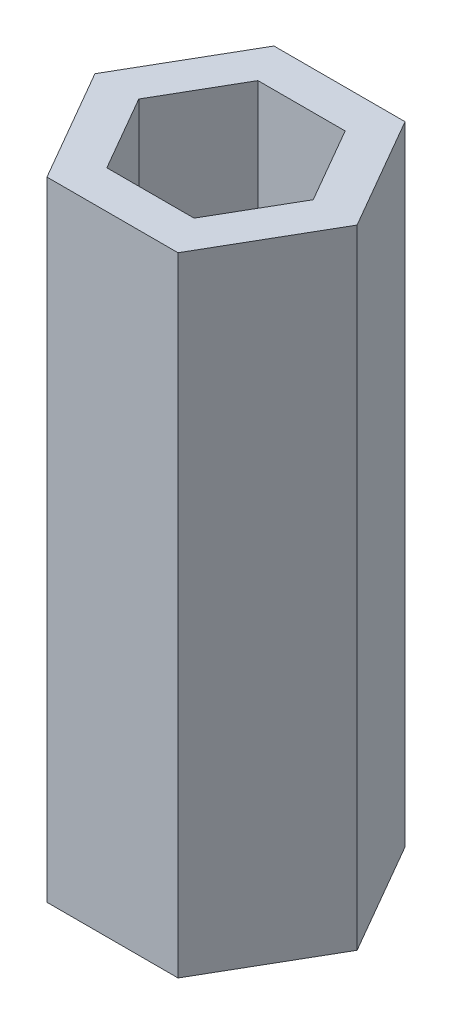
ISO-10303-21;
HEADER;
FILE_DESCRIPTION(('STEP AP214'),'2;1');
FILE_NAME('part.step','',(''),(''),'','','');
FILE_SCHEMA(('AUTOMOTIVE_DESIGN { 1 0 10303 214 1 1 1 1 }'));
ENDSEC;
DATA;
#1=APPLICATION_CONTEXT('core data for automotive mechanical design processes');
#2=APPLICATION_PROTOCOL_DEFINITION('international standard','automotive_design',2000,#1);
#3=PRODUCT_CONTEXT('',#1,'mechanical');
#4=PRODUCT('Part','Part','',(#3));
#5=PRODUCT_RELATED_PRODUCT_CATEGORY('part','',(#4));
#6=PRODUCT_DEFINITION_FORMATION('','',#4);
#7=PRODUCT_DEFINITION_CONTEXT('part definition',#1,'design');
#8=PRODUCT_DEFINITION('design','',#6,#7);
#9=PRODUCT_DEFINITION_SHAPE('','',#8);
#10=(LENGTH_UNIT() NAMED_UNIT(*) SI_UNIT(.MILLI.,.METRE.));
#11=(NAMED_UNIT(*) PLANE_ANGLE_UNIT() SI_UNIT($,.RADIAN.));
#12=(NAMED_UNIT(*) SI_UNIT($,.STERADIAN.) SOLID_ANGLE_UNIT());
#13=UNCERTAINTY_MEASURE_WITH_UNIT(LENGTH_MEASURE(1.E-05),#10,'distance_accuracy_value','');
#14=(GEOMETRIC_REPRESENTATION_CONTEXT(3) GLOBAL_UNCERTAINTY_ASSIGNED_CONTEXT((#13)) GLOBAL_UNIT_ASSIGNED_CONTEXT((#10,
#11,#12)) REPRESENTATION_CONTEXT('',''));
#15=CARTESIAN_POINT('',(0.,0.,0.));
#16=DIRECTION('',(0.,0.,1.));
#17=DIRECTION('',(1.,0.,0.));
#18=AXIS2_PLACEMENT_3D('',#15,#16,#17);
#19=CARTESIAN_POINT('',(0.,29.515472084,0.));
#20=DIRECTION('',(0.,1.,0.));
#21=DIRECTION('',(0.,0.,1.));
#22=AXIS2_PLACEMENT_3D('',#19,#20,#21);
#23=PLANE('',#22);
#24=DIRECTION('',(0.499999999999999,0.,-0.866025403784439));
#25=VECTOR('',#24,1.);
#26=CARTESIAN_POINT('',(3.07958633585747,29.515472084,5.334));
#27=LINE('',#26,#25);
#28=CARTESIAN_POINT('',(3.07958633585747,29.515472084,5.334));
#29=VERTEX_POINT('',#28);
#30=CARTESIAN_POINT('',(6.15917267171493,29.515472084,0.));
#31=VERTEX_POINT('',#30);
#32=EDGE_CURVE('E177',#29,#31,#27,.T.);
#33=ORIENTED_EDGE('',*,*,#32,.T.);
#34=DIRECTION('',(-0.5,0.,-0.866025403784438));
#35=VECTOR('',#34,1.);
#36=CARTESIAN_POINT('',(6.15917267171493,29.515472084,0.));
#37=LINE('',#36,#35);
#38=CARTESIAN_POINT('',(3.07958633585746,29.515472084,-5.334));
#39=VERTEX_POINT('',#38);
#40=EDGE_CURVE('E180',#31,#39,#37,.T.);
#41=ORIENTED_EDGE('',*,*,#40,.T.);
#42=DIRECTION('',(-1.,0.,0.));
#43=VECTOR('',#42,1.);
#44=CARTESIAN_POINT('',(3.07958633585746,29.515472084,-5.334));
#45=LINE('',#44,#43);
#46=CARTESIAN_POINT('',(-3.07958633585747,29.515472084,-5.334));
#47=VERTEX_POINT('',#46);
#48=EDGE_CURVE('E183',#39,#47,#45,.T.);
#49=ORIENTED_EDGE('',*,*,#48,.T.);
#50=DIRECTION('',(-0.5,0.,0.866025403784439));
#51=VECTOR('',#50,1.);
#52=CARTESIAN_POINT('',(-3.07958633585747,29.515472084,-5.334));
#53=LINE('',#52,#51);
#54=CARTESIAN_POINT('',(-6.15917267171493,29.515472084,0.));
#55=VERTEX_POINT('',#54);
#56=EDGE_CURVE('E185',#47,#55,#53,.T.);
#57=ORIENTED_EDGE('',*,*,#56,.T.);
#58=DIRECTION('',(0.5,0.,0.866025403784438));
#59=VECTOR('',#58,1.);
#60=CARTESIAN_POINT('',(-6.15917267171493,29.515472084,0.));
#61=LINE('',#60,#59);
#62=CARTESIAN_POINT('',(-3.07958633585746,29.515472084,5.334));
#63=VERTEX_POINT('',#62);
#64=EDGE_CURVE('E187',#55,#63,#61,.T.);
#65=ORIENTED_EDGE('',*,*,#64,.T.);
#66=DIRECTION('',(1.,0.,0.));
#67=VECTOR('',#66,1.);
#68=CARTESIAN_POINT('',(-3.07958633585746,29.515472084,5.334));
#69=LINE('',#68,#67);
#70=EDGE_CURVE('E189',#63,#29,#69,.T.);
#71=ORIENTED_EDGE('',*,*,#70,.T.);
#72=EDGE_LOOP('',(#33,#41,#49,#57,#65,#71));
#73=FACE_BOUND('',#72,.T.);
#74=DIRECTION('',(-0.500000000000001,0.,-0.866025403784438));
#75=VECTOR('',#74,1.);
#76=CARTESIAN_POINT('',(4.09878276605789,29.515472084,0.));
#77=LINE('',#76,#75);
#78=CARTESIAN_POINT('',(4.09878276605789,29.515472084,0.));
#79=VERTEX_POINT('',#78);
#80=CARTESIAN_POINT('',(2.04939138302894,29.515472084,-3.54964999999999));
#81=VERTEX_POINT('',#80);
#82=EDGE_CURVE('E134',#79,#81,#77,.T.);
#83=ORIENTED_EDGE('',*,*,#82,.F.);
#84=DIRECTION('',(0.499999999999995,0.,-0.866025403784441));
#85=VECTOR('',#84,1.);
#86=CARTESIAN_POINT('',(2.04939138302899,29.515472084,3.54964999999996));
#87=LINE('',#86,#85);
#88=CARTESIAN_POINT('',(2.04939138302899,29.515472084,3.54964999999996));
#89=VERTEX_POINT('',#88);
#90=EDGE_CURVE('E126',#89,#79,#87,.T.);
#91=ORIENTED_EDGE('',*,*,#90,.F.);
#92=DIRECTION('',(1.,0.,0.));
#93=VECTOR('',#92,1.);
#94=CARTESIAN_POINT('',(-2.04939138302891,29.515472084,3.54965));
#95=LINE('',#94,#93);
#96=CARTESIAN_POINT('',(-2.04939138302891,29.515472084,3.54965));
#97=VERTEX_POINT('',#96);
#98=EDGE_CURVE('E155',#97,#89,#95,.T.);
#99=ORIENTED_EDGE('',*,*,#98,.F.);
#100=DIRECTION('',(0.500000000000007,0.,0.866025403784435));
#101=VECTOR('',#100,1.);
#102=CARTESIAN_POINT('',(-4.09878276605789,29.515472084,0.));
#103=LINE('',#102,#101);
#104=CARTESIAN_POINT('',(-4.09878276605789,29.515472084,0.));
#105=VERTEX_POINT('',#104);
#106=EDGE_CURVE('E153',#105,#97,#103,.T.);
#107=ORIENTED_EDGE('',*,*,#106,.F.);
#108=DIRECTION('',(-0.499999999999995,0.,0.866025403784442));
#109=VECTOR('',#108,1.);
#110=CARTESIAN_POINT('',(-2.04939138302896,29.515472084,-3.54964999999997));
#111=LINE('',#110,#109);
#112=CARTESIAN_POINT('',(-2.04939138302896,29.515472084,-3.54964999999997));
#113=VERTEX_POINT('',#112);
#114=EDGE_CURVE('E149',#113,#105,#111,.T.);
#115=ORIENTED_EDGE('',*,*,#114,.F.);
#116=DIRECTION('',(-1.,0.,0.));
#117=VECTOR('',#116,1.);
#118=CARTESIAN_POINT('',(2.04939138302894,29.515472084,-3.54964999999999));
#119=LINE('',#118,#117);
#120=EDGE_CURVE('E147',#81,#113,#119,.T.);
#121=ORIENTED_EDGE('',*,*,#120,.F.);
#122=EDGE_LOOP('',(#83,#91,#99,#107,#115,#121));
#123=FACE_BOUND('',#122,.T.);
#124=ADVANCED_FACE('F37',(#73,#123),#23,.T.);
#125=CARTESIAN_POINT('',(0.,0.,0.));
#126=DIRECTION('',(0.,1.,0.));
#127=DIRECTION('',(0.,0.,1.));
#128=AXIS2_PLACEMENT_3D('',#125,#126,#127);
#129=PLANE('',#128);
#130=DIRECTION('',(0.499999999999999,0.,-0.866025403784439));
#131=VECTOR('',#130,1.);
#132=CARTESIAN_POINT('',(3.07958633585747,0.,5.334));
#133=LINE('',#132,#131);
#134=CARTESIAN_POINT('',(3.07958633585747,0.,5.334));
#135=VERTEX_POINT('',#134);
#136=CARTESIAN_POINT('',(6.15917267171493,0.,0.));
#137=VERTEX_POINT('',#136);
#138=EDGE_CURVE('E142',#135,#137,#133,.T.);
#139=ORIENTED_EDGE('',*,*,#138,.F.);
#140=DIRECTION('',(1.,0.,0.));
#141=VECTOR('',#140,1.);
#142=CARTESIAN_POINT('',(-3.07958633585746,0.,5.334));
#143=LINE('',#142,#141);
#144=CARTESIAN_POINT('',(-3.07958633585746,0.,5.334));
#145=VERTEX_POINT('',#144);
#146=EDGE_CURVE('E181',#145,#135,#143,.T.);
#147=ORIENTED_EDGE('',*,*,#146,.F.);
#148=DIRECTION('',(0.5,0.,0.866025403784438));
#149=VECTOR('',#148,1.);
#150=CARTESIAN_POINT('',(-6.15917267171493,0.,0.));
#151=LINE('',#150,#149);
#152=CARTESIAN_POINT('',(-6.15917267171493,0.,0.));
#153=VERTEX_POINT('',#152);
#154=EDGE_CURVE('E200',#153,#145,#151,.T.);
#155=ORIENTED_EDGE('',*,*,#154,.F.);
#156=DIRECTION('',(-0.5,0.,0.866025403784439));
#157=VECTOR('',#156,1.);
#158=CARTESIAN_POINT('',(-3.07958633585747,0.,-5.334));
#159=LINE('',#158,#157);
#160=CARTESIAN_POINT('',(-3.07958633585747,0.,-5.334));
#161=VERTEX_POINT('',#160);
#162=EDGE_CURVE('E198',#161,#153,#159,.T.);
#163=ORIENTED_EDGE('',*,*,#162,.F.);
#164=DIRECTION('',(-1.,0.,0.));
#165=VECTOR('',#164,1.);
#166=CARTESIAN_POINT('',(3.07958633585746,0.,-5.334));
#167=LINE('',#166,#165);
#168=CARTESIAN_POINT('',(3.07958633585746,0.,-5.334));
#169=VERTEX_POINT('',#168);
#170=EDGE_CURVE('E196',#169,#161,#167,.T.);
#171=ORIENTED_EDGE('',*,*,#170,.F.);
#172=DIRECTION('',(-0.5,0.,-0.866025403784438));
#173=VECTOR('',#172,1.);
#174=CARTESIAN_POINT('',(6.15917267171493,0.,0.));
#175=LINE('',#174,#173);
#176=EDGE_CURVE('E194',#137,#169,#175,.T.);
#177=ORIENTED_EDGE('',*,*,#176,.F.);
#178=EDGE_LOOP('',(#139,#147,#155,#163,#171,#177));
#179=FACE_BOUND('',#178,.T.);
#180=DIRECTION('',(0.499999999999995,0.,-0.866025403784441));
#181=VECTOR('',#180,1.);
#182=CARTESIAN_POINT('',(2.04939138302899,0.,3.54964999999996));
#183=LINE('',#182,#181);
#184=CARTESIAN_POINT('',(2.04939138302899,0.,3.54964999999996));
#185=VERTEX_POINT('',#184);
#186=CARTESIAN_POINT('',(4.09878276605789,0.,0.));
#187=VERTEX_POINT('',#186);
#188=EDGE_CURVE('E60',#185,#187,#183,.T.);
#189=ORIENTED_EDGE('',*,*,#188,.T.);
#190=DIRECTION('',(-0.500000000000001,0.,-0.866025403784438));
#191=VECTOR('',#190,1.);
#192=CARTESIAN_POINT('',(4.09878276605789,0.,0.));
#193=LINE('',#192,#191);
#194=CARTESIAN_POINT('',(2.04939138302894,0.,-3.54964999999999));
#195=VERTEX_POINT('',#194);
#196=EDGE_CURVE('E141',#187,#195,#193,.T.);
#197=ORIENTED_EDGE('',*,*,#196,.T.);
#198=DIRECTION('',(-1.,0.,0.));
#199=VECTOR('',#198,1.);
#200=CARTESIAN_POINT('',(2.04939138302894,0.,-3.54964999999999));
#201=LINE('',#200,#199);
#202=CARTESIAN_POINT('',(-2.04939138302896,0.,-3.54964999999997));
#203=VERTEX_POINT('',#202);
#204=EDGE_CURVE('E159',#195,#203,#201,.T.);
#205=ORIENTED_EDGE('',*,*,#204,.T.);
#206=DIRECTION('',(-0.499999999999995,0.,0.866025403784442));
#207=VECTOR('',#206,1.);
#208=CARTESIAN_POINT('',(-2.04939138302896,0.,-3.54964999999997));
#209=LINE('',#208,#207);
#210=CARTESIAN_POINT('',(-4.09878276605789,0.,0.));
#211=VERTEX_POINT('',#210);
#212=EDGE_CURVE('E162',#203,#211,#209,.T.);
#213=ORIENTED_EDGE('',*,*,#212,.T.);
#214=DIRECTION('',(0.500000000000007,0.,0.866025403784435));
#215=VECTOR('',#214,1.);
#216=CARTESIAN_POINT('',(-4.09878276605789,0.,0.));
#217=LINE('',#216,#215);
#218=CARTESIAN_POINT('',(-2.04939138302891,0.,3.54965));
#219=VERTEX_POINT('',#218);
#220=EDGE_CURVE('E165',#211,#219,#217,.T.);
#221=ORIENTED_EDGE('',*,*,#220,.T.);
#222=DIRECTION('',(1.,0.,0.));
#223=VECTOR('',#222,1.);
#224=CARTESIAN_POINT('',(-2.04939138302891,0.,3.54965));
#225=LINE('',#224,#223);
#226=EDGE_CURVE('E135',#219,#185,#225,.T.);
#227=ORIENTED_EDGE('',*,*,#226,.T.);
#228=EDGE_LOOP('',(#189,#197,#205,#213,#221,#227));
#229=FACE_BOUND('',#228,.T.);
#230=ADVANCED_FACE('F224',(#179,#229),#129,.F.);
#231=CARTESIAN_POINT('',(3.07958633585747,29.515472084,5.334));
#232=DIRECTION('',(-0.866025403784439,0.,-0.499999999999999));
#233=DIRECTION('',(-0.5,0.,0.866025403784439));
#234=AXIS2_PLACEMENT_3D('',#231,#232,#233);
#235=PLANE('',#234);
#236=ORIENTED_EDGE('',*,*,#138,.T.);
#237=DIRECTION('',(0.,-1.,0.));
#238=VECTOR('',#237,1.);
#239=CARTESIAN_POINT('',(6.15917267171493,29.515472084,0.));
#240=LINE('',#239,#238);
#241=EDGE_CURVE('E11',#31,#137,#240,.T.);
#242=ORIENTED_EDGE('',*,*,#241,.F.);
#243=ORIENTED_EDGE('',*,*,#32,.F.);
#244=DIRECTION('',(0.,-1.,0.));
#245=VECTOR('',#244,1.);
#246=CARTESIAN_POINT('',(3.07958633585747,29.515472084,5.334));
#247=LINE('',#246,#245);
#248=EDGE_CURVE('E191',#29,#135,#247,.T.);
#249=ORIENTED_EDGE('',*,*,#248,.T.);
#250=EDGE_LOOP('',(#236,#242,#243,#249));
#251=FACE_BOUND('',#250,.T.);
#252=ADVANCED_FACE('F39',(#251),#235,.F.);
#253=CARTESIAN_POINT('',(6.15917267171493,29.515472084,0.));
#254=DIRECTION('',(-0.866025403784439,0.,0.5));
#255=DIRECTION('',(0.5,0.,0.866025403784439));
#256=AXIS2_PLACEMENT_3D('',#253,#254,#255);
#257=PLANE('',#256);
#258=ORIENTED_EDGE('',*,*,#176,.T.);
#259=DIRECTION('',(0.,-1.,0.));
#260=VECTOR('',#259,1.);
#261=CARTESIAN_POINT('',(3.07958633585746,29.515472084,-5.334));
#262=LINE('',#261,#260);
#263=EDGE_CURVE('E45',#39,#169,#262,.T.);
#264=ORIENTED_EDGE('',*,*,#263,.F.);
#265=ORIENTED_EDGE('',*,*,#40,.F.);
#266=ORIENTED_EDGE('',*,*,#241,.T.);
#267=EDGE_LOOP('',(#258,#264,#265,#266));
#268=FACE_BOUND('',#267,.T.);
#269=ADVANCED_FACE('F241',(#268),#257,.F.);
#270=CARTESIAN_POINT('',(3.07958633585746,29.515472084,-5.334));
#271=DIRECTION('',(0.,0.,1.));
#272=DIRECTION('',(1.,0.,0.));
#273=AXIS2_PLACEMENT_3D('',#270,#271,#272);
#274=PLANE('',#273);
#275=ORIENTED_EDGE('',*,*,#170,.T.);
#276=DIRECTION('',(0.,-1.,0.));
#277=VECTOR('',#276,1.);
#278=CARTESIAN_POINT('',(-3.07958633585747,29.515472084,-5.334));
#279=LINE('',#278,#277);
#280=EDGE_CURVE('E211',#47,#161,#279,.T.);
#281=ORIENTED_EDGE('',*,*,#280,.F.);
#282=ORIENTED_EDGE('',*,*,#48,.F.);
#283=ORIENTED_EDGE('',*,*,#263,.T.);
#284=EDGE_LOOP('',(#275,#281,#282,#283));
#285=FACE_BOUND('',#284,.T.);
#286=ADVANCED_FACE('F218',(#285),#274,.F.);
#287=CARTESIAN_POINT('',(-3.07958633585747,29.515472084,-5.334));
#288=DIRECTION('',(0.866025403784439,0.,0.499999999999999));
#289=DIRECTION('',(0.5,0.,-0.866025403784439));
#290=AXIS2_PLACEMENT_3D('',#287,#288,#289);
#291=PLANE('',#290);
#292=ORIENTED_EDGE('',*,*,#162,.T.);
#293=DIRECTION('',(0.,-1.,0.));
#294=VECTOR('',#293,1.);
#295=CARTESIAN_POINT('',(-6.15917267171493,29.515472084,0.));
#296=LINE('',#295,#294);
#297=EDGE_CURVE('E208',#55,#153,#296,.T.);
#298=ORIENTED_EDGE('',*,*,#297,.F.);
#299=ORIENTED_EDGE('',*,*,#56,.F.);
#300=ORIENTED_EDGE('',*,*,#280,.T.);
#301=EDGE_LOOP('',(#292,#298,#299,#300));
#302=FACE_BOUND('',#301,.T.);
#303=ADVANCED_FACE('F230',(#302),#291,.F.);
#304=CARTESIAN_POINT('',(-6.15917267171493,29.515472084,0.));
#305=DIRECTION('',(0.866025403784439,0.,-0.5));
#306=DIRECTION('',(-0.5,0.,-0.866025403784439));
#307=AXIS2_PLACEMENT_3D('',#304,#305,#306);
#308=PLANE('',#307);
#309=ORIENTED_EDGE('',*,*,#154,.T.);
#310=DIRECTION('',(0.,-1.,0.));
#311=VECTOR('',#310,1.);
#312=CARTESIAN_POINT('',(-3.07958633585746,29.515472084,5.334));
#313=LINE('',#312,#311);
#314=EDGE_CURVE('E205',#63,#145,#313,.T.);
#315=ORIENTED_EDGE('',*,*,#314,.F.);
#316=ORIENTED_EDGE('',*,*,#64,.F.);
#317=ORIENTED_EDGE('',*,*,#297,.T.);
#318=EDGE_LOOP('',(#309,#315,#316,#317));
#319=FACE_BOUND('',#318,.T.);
#320=ADVANCED_FACE('F234',(#319),#308,.F.);
#321=CARTESIAN_POINT('',(-3.07958633585746,29.515472084,5.334));
#322=DIRECTION('',(0.,0.,-1.));
#323=DIRECTION('',(-1.,0.,0.));
#324=AXIS2_PLACEMENT_3D('',#321,#322,#323);
#325=PLANE('',#324);
#326=ORIENTED_EDGE('',*,*,#146,.T.);
#327=ORIENTED_EDGE('',*,*,#248,.F.);
#328=ORIENTED_EDGE('',*,*,#70,.F.);
#329=ORIENTED_EDGE('',*,*,#314,.T.);
#330=EDGE_LOOP('',(#326,#327,#328,#329));
#331=FACE_BOUND('',#330,.T.);
#332=ADVANCED_FACE('F244',(#331),#325,.F.);
#333=CARTESIAN_POINT('',(2.04939138302899,29.515472084,3.54964999999996));
#334=DIRECTION('',(-0.866025403784441,0.,-0.499999999999995));
#335=DIRECTION('',(-0.499999999999995,0.,0.866025403784442));
#336=AXIS2_PLACEMENT_3D('',#333,#334,#335);
#337=PLANE('',#336);
#338=ORIENTED_EDGE('',*,*,#188,.F.);
#339=DIRECTION('',(0.,-1.,0.));
#340=VECTOR('',#339,1.);
#341=CARTESIAN_POINT('',(2.04939138302899,29.515472084,3.54964999999996));
#342=LINE('',#341,#340);
#343=EDGE_CURVE('E130',#89,#185,#342,.T.);
#344=ORIENTED_EDGE('',*,*,#343,.F.);
#345=ORIENTED_EDGE('',*,*,#90,.T.);
#346=DIRECTION('',(0.,-1.,0.));
#347=VECTOR('',#346,1.);
#348=CARTESIAN_POINT('',(4.09878276605789,29.515472084,0.));
#349=LINE('',#348,#347);
#350=EDGE_CURVE('E129',#79,#187,#349,.T.);
#351=ORIENTED_EDGE('',*,*,#350,.T.);
#352=EDGE_LOOP('',(#338,#344,#345,#351));
#353=FACE_BOUND('',#352,.T.);
#354=ADVANCED_FACE('F128',(#353),#337,.T.);
#355=CARTESIAN_POINT('',(4.09878276605789,29.515472084,0.));
#356=DIRECTION('',(-0.866025403784438,0.,0.500000000000001));
#357=DIRECTION('',(0.500000000000001,0.,0.866025403784438));
#358=AXIS2_PLACEMENT_3D('',#355,#356,#357);
#359=PLANE('',#358);
#360=ORIENTED_EDGE('',*,*,#196,.F.);
#361=ORIENTED_EDGE('',*,*,#350,.F.);
#362=ORIENTED_EDGE('',*,*,#82,.T.);
#363=DIRECTION('',(0.,-1.,0.));
#364=VECTOR('',#363,1.);
#365=CARTESIAN_POINT('',(2.04939138302894,29.515472084,-3.54964999999999));
#366=LINE('',#365,#364);
#367=EDGE_CURVE('E143',#81,#195,#366,.T.);
#368=ORIENTED_EDGE('',*,*,#367,.T.);
#369=EDGE_LOOP('',(#360,#361,#362,#368));
#370=FACE_BOUND('',#369,.T.);
#371=ADVANCED_FACE('F138',(#370),#359,.T.);
#372=CARTESIAN_POINT('',(2.04939138302894,29.515472084,-3.54964999999999));
#373=DIRECTION('',(0.,0.,1.));
#374=DIRECTION('',(1.,0.,0.));
#375=AXIS2_PLACEMENT_3D('',#372,#373,#374);
#376=PLANE('',#375);
#377=ORIENTED_EDGE('',*,*,#204,.F.);
#378=ORIENTED_EDGE('',*,*,#367,.F.);
#379=ORIENTED_EDGE('',*,*,#120,.T.);
#380=DIRECTION('',(0.,-1.,0.));
#381=VECTOR('',#380,1.);
#382=CARTESIAN_POINT('',(-2.04939138302896,29.515472084,-3.54964999999997));
#383=LINE('',#382,#381);
#384=EDGE_CURVE('E174',#113,#203,#383,.T.);
#385=ORIENTED_EDGE('',*,*,#384,.T.);
#386=EDGE_LOOP('',(#377,#378,#379,#385));
#387=FACE_BOUND('',#386,.T.);
#388=ADVANCED_FACE('F262',(#387),#376,.T.);
#389=CARTESIAN_POINT('',(-2.04939138302896,29.515472084,-3.54964999999997));
#390=DIRECTION('',(0.866025403784442,0.,0.499999999999995));
#391=DIRECTION('',(0.499999999999995,0.,-0.866025403784442));
#392=AXIS2_PLACEMENT_3D('',#389,#390,#391);
#393=PLANE('',#392);
#394=ORIENTED_EDGE('',*,*,#212,.F.);
#395=ORIENTED_EDGE('',*,*,#384,.F.);
#396=ORIENTED_EDGE('',*,*,#114,.T.);
#397=DIRECTION('',(0.,-1.,0.));
#398=VECTOR('',#397,1.);
#399=CARTESIAN_POINT('',(-4.09878276605789,29.515472084,0.));
#400=LINE('',#399,#398);
#401=EDGE_CURVE('E172',#105,#211,#400,.T.);
#402=ORIENTED_EDGE('',*,*,#401,.T.);
#403=EDGE_LOOP('',(#394,#395,#396,#402));
#404=FACE_BOUND('',#403,.T.);
#405=ADVANCED_FACE('F265',(#404),#393,.T.);
#406=CARTESIAN_POINT('',(-4.09878276605789,29.515472084,0.));
#407=DIRECTION('',(0.866025403784435,0.,-0.500000000000007));
#408=DIRECTION('',(-0.500000000000007,0.,-0.866025403784435));
#409=AXIS2_PLACEMENT_3D('',#406,#407,#408);
#410=PLANE('',#409);
#411=ORIENTED_EDGE('',*,*,#220,.F.);
#412=ORIENTED_EDGE('',*,*,#401,.F.);
#413=ORIENTED_EDGE('',*,*,#106,.T.);
#414=DIRECTION('',(0.,-1.,0.));
#415=VECTOR('',#414,1.);
#416=CARTESIAN_POINT('',(-2.04939138302891,29.515472084,3.54965));
#417=LINE('',#416,#415);
#418=EDGE_CURVE('E52',#97,#219,#417,.T.);
#419=ORIENTED_EDGE('',*,*,#418,.T.);
#420=EDGE_LOOP('',(#411,#412,#413,#419));
#421=FACE_BOUND('',#420,.T.);
#422=ADVANCED_FACE('F269',(#421),#410,.T.);
#423=CARTESIAN_POINT('',(-2.04939138302891,29.515472084,3.54965));
#424=DIRECTION('',(0.,0.,-1.));
#425=DIRECTION('',(-1.,0.,0.));
#426=AXIS2_PLACEMENT_3D('',#423,#424,#425);
#427=PLANE('',#426);
#428=ORIENTED_EDGE('',*,*,#226,.F.);
#429=ORIENTED_EDGE('',*,*,#418,.F.);
#430=ORIENTED_EDGE('',*,*,#98,.T.);
#431=ORIENTED_EDGE('',*,*,#343,.T.);
#432=EDGE_LOOP('',(#428,#429,#430,#431));
#433=FACE_BOUND('',#432,.T.);
#434=ADVANCED_FACE('F273',(#433),#427,.T.);
#435=CLOSED_SHELL('',(#124,#230,#252,#269,#286,#303,#320,#332,#354,#371,#388,#405,#422,#434));
#436=MANIFOLD_SOLID_BREP('B2',#435);
#437=ADVANCED_BREP_SHAPE_REPRESENTATION('',(#18,#436),#14);
#438=SHAPE_DEFINITION_REPRESENTATION(#9,#437);
ENDSEC;
END-ISO-10303-21;
